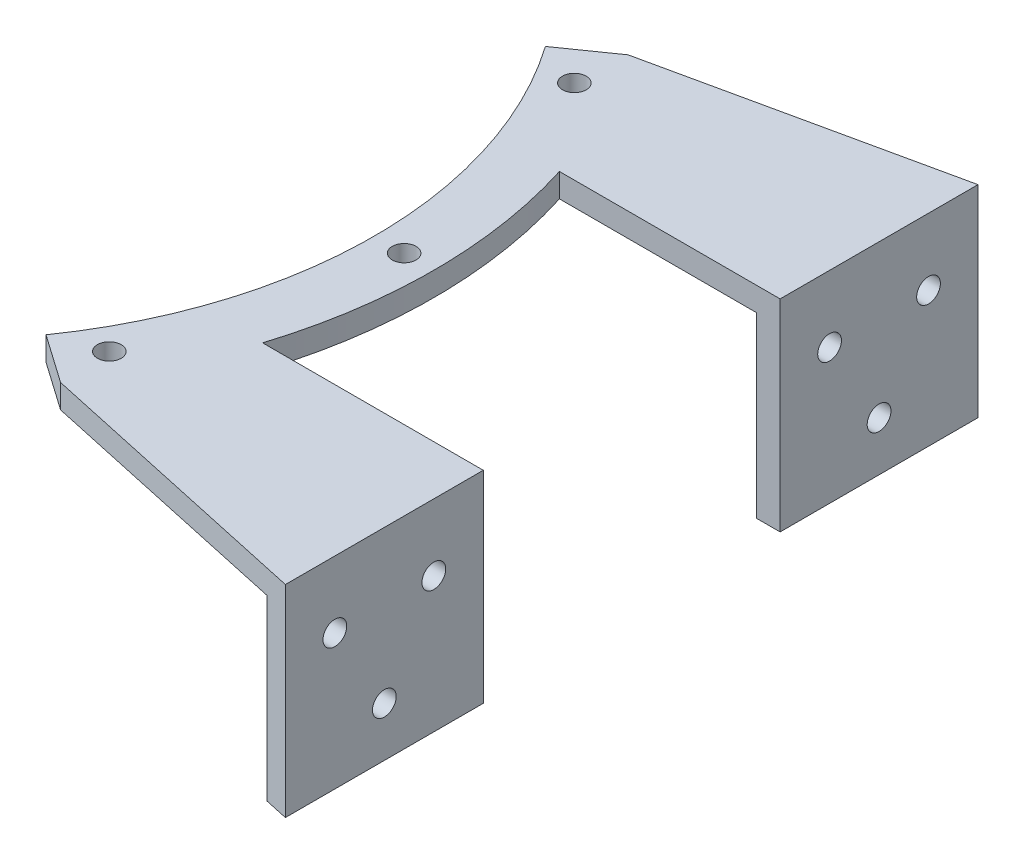
ISO-10303-21;
HEADER;
FILE_DESCRIPTION(('STEP AP214'),'2;1');
FILE_NAME('part.step','',(''),(''),'','','');
FILE_SCHEMA(('AUTOMOTIVE_DESIGN { 1 0 10303 214 1 1 1 1 }'));
ENDSEC;
DATA;
#1=APPLICATION_CONTEXT('core data for automotive mechanical design processes');
#2=APPLICATION_PROTOCOL_DEFINITION('international standard','automotive_design',2000,#1);
#3=PRODUCT_CONTEXT('',#1,'mechanical');
#4=PRODUCT('Part','Part','',(#3));
#5=PRODUCT_RELATED_PRODUCT_CATEGORY('part','',(#4));
#6=PRODUCT_DEFINITION_FORMATION('','',#4);
#7=PRODUCT_DEFINITION_CONTEXT('part definition',#1,'design');
#8=PRODUCT_DEFINITION('design','',#6,#7);
#9=PRODUCT_DEFINITION_SHAPE('','',#8);
#10=(LENGTH_UNIT() NAMED_UNIT(*) SI_UNIT(.MILLI.,.METRE.));
#11=(NAMED_UNIT(*) PLANE_ANGLE_UNIT() SI_UNIT($,.RADIAN.));
#12=(NAMED_UNIT(*) SI_UNIT($,.STERADIAN.) SOLID_ANGLE_UNIT());
#13=UNCERTAINTY_MEASURE_WITH_UNIT(LENGTH_MEASURE(1.E-05),#10,'distance_accuracy_value','');
#14=(GEOMETRIC_REPRESENTATION_CONTEXT(3) GLOBAL_UNCERTAINTY_ASSIGNED_CONTEXT((#13)) GLOBAL_UNIT_ASSIGNED_CONTEXT((#10,
#11,#12)) REPRESENTATION_CONTEXT('',''));
#15=CARTESIAN_POINT('',(0.,0.,0.));
#16=DIRECTION('',(0.,0.,1.));
#17=DIRECTION('',(1.,0.,0.));
#18=AXIS2_PLACEMENT_3D('',#15,#16,#17);
#19=CARTESIAN_POINT('',(0.,0.,0.));
#20=DIRECTION('',(0.,1.,0.));
#21=DIRECTION('',(0.,0.,1.));
#22=AXIS2_PLACEMENT_3D('',#19,#20,#21);
#23=PLANE('',#22);
#24=CARTESIAN_POINT('',(203.515969889343,0.,117.5));
#25=DIRECTION('',(0.,1.,0.));
#26=DIRECTION('',(0.,0.,1.));
#27=AXIS2_PLACEMENT_3D('',#24,#25,#26);
#28=CIRCLE('',#27,5.99999999999999);
#29=CARTESIAN_POINT('',(203.515969889343,0.,123.5));
#30=VERTEX_POINT('',#29);
#31=EDGE_CURVE('E191',#30,#30,#28,.T.);
#32=ORIENTED_EDGE('',*,*,#31,.T.);
#33=EDGE_LOOP('',(#32));
#34=FACE_BOUND('',#33,.T.);
#35=CARTESIAN_POINT('',(235.,0.,0.));
#36=DIRECTION('',(0.,1.,0.));
#37=DIRECTION('',(0.,0.,1.));
#38=AXIS2_PLACEMENT_3D('',#35,#36,#37);
#39=CIRCLE('',#38,5.99999999999999);
#40=CARTESIAN_POINT('',(235.,0.,5.99999999999999));
#41=VERTEX_POINT('',#40);
#42=EDGE_CURVE('E185',#41,#41,#39,.T.);
#43=ORIENTED_EDGE('',*,*,#42,.T.);
#44=EDGE_LOOP('',(#43));
#45=FACE_BOUND('',#44,.T.);
#46=CARTESIAN_POINT('',(203.515969889343,0.,-117.5));
#47=DIRECTION('',(0.,1.,0.));
#48=DIRECTION('',(0.,0.,1.));
#49=AXIS2_PLACEMENT_3D('',#46,#47,#48);
#50=CIRCLE('',#49,5.99999999999999);
#51=CARTESIAN_POINT('',(203.515969889343,0.,-111.5));
#52=VERTEX_POINT('',#51);
#53=EDGE_CURVE('E181',#52,#52,#50,.T.);
#54=ORIENTED_EDGE('',*,*,#53,.T.);
#55=EDGE_LOOP('',(#54));
#56=FACE_BOUND('',#55,.T.);
#57=DIRECTION('',(0.,0.,-1.));
#58=VECTOR('',#57,1.);
#59=CARTESIAN_POINT('',(338.,0.,-172.388158555313));
#60=LINE('',#59,#58);
#61=CARTESIAN_POINT('',(338.,0.,-75.));
#62=VERTEX_POINT('',#61);
#63=CARTESIAN_POINT('',(338.,0.,-172.388158555313));
#64=VERTEX_POINT('',#63);
#65=EDGE_CURVE('E153',#62,#64,#60,.T.);
#66=ORIENTED_EDGE('',*,*,#65,.F.);
#67=DIRECTION('',(1.,0.,0.));
#68=VECTOR('',#67,1.);
#69=CARTESIAN_POINT('',(350.,0.,-75.));
#70=LINE('',#69,#68);
#71=CARTESIAN_POINT('',(238.484800354236,0.,-75.));
#72=VERTEX_POINT('',#71);
#73=EDGE_CURVE('E158',#72,#62,#70,.T.);
#74=ORIENTED_EDGE('',*,*,#73,.F.);
#75=CARTESIAN_POINT('',(0.,0.,0.));
#76=DIRECTION('',(0.,1.,0.));
#77=DIRECTION('',(0.,0.,1.));
#78=AXIS2_PLACEMENT_3D('',#75,#76,#77);
#79=CIRCLE('',#78,250.);
#80=CARTESIAN_POINT('',(238.484800354236,0.,75.));
#81=VERTEX_POINT('',#80);
#82=EDGE_CURVE('E203',#81,#72,#79,.T.);
#83=ORIENTED_EDGE('',*,*,#82,.F.);
#84=DIRECTION('',(-1.,0.,0.));
#85=VECTOR('',#84,1.);
#86=CARTESIAN_POINT('',(350.,0.,75.));
#87=LINE('',#86,#85);
#88=CARTESIAN_POINT('',(338.,0.,75.));
#89=VERTEX_POINT('',#88);
#90=EDGE_CURVE('E233',#89,#81,#87,.T.);
#91=ORIENTED_EDGE('',*,*,#90,.F.);
#92=DIRECTION('',(0.,0.,-1.));
#93=VECTOR('',#92,1.);
#94=CARTESIAN_POINT('',(338.,0.,75.));
#95=LINE('',#94,#93);
#96=CARTESIAN_POINT('',(338.,0.,172.388158555313));
#97=VERTEX_POINT('',#96);
#98=EDGE_CURVE('E58',#97,#89,#95,.T.);
#99=ORIENTED_EDGE('',*,*,#98,.F.);
#100=DIRECTION('',(0.97712316091758,0.,0.212674230687305));
#101=VECTOR('',#100,1.);
#102=CARTESIAN_POINT('',(204.788011072248,0.,143.394109087761));
#103=LINE('',#102,#101);
#104=CARTESIAN_POINT('',(204.788011072248,0.,143.394109087761));
#105=VERTEX_POINT('',#104);
#106=EDGE_CURVE('E231',#105,#97,#103,.T.);
#107=ORIENTED_EDGE('',*,*,#106,.F.);
#108=DIRECTION('',(0.819152044288993,0.,0.573576436351044));
#109=VECTOR('',#108,1.);
#110=CARTESIAN_POINT('',(180.213449743579,0.,126.18681599723));
#111=LINE('',#110,#109);
#112=CARTESIAN_POINT('',(180.213449743578,0.,126.18681599723));
#113=VERTEX_POINT('',#112);
#114=EDGE_CURVE('E229',#113,#105,#111,.T.);
#115=ORIENTED_EDGE('',*,*,#114,.F.);
#116=CARTESIAN_POINT('',(0.,0.,0.));
#117=DIRECTION('',(0.,-1.,0.));
#118=DIRECTION('',(0.,0.,1.));
#119=AXIS2_PLACEMENT_3D('',#116,#117,#118);
#120=CIRCLE('',#119,220.);
#121=CARTESIAN_POINT('',(180.213449743579,0.,-126.18681599723));
#122=VERTEX_POINT('',#121);
#123=EDGE_CURVE('E227',#122,#113,#120,.T.);
#124=ORIENTED_EDGE('',*,*,#123,.F.);
#125=DIRECTION('',(-0.819152044288993,0.,0.573576436351044));
#126=VECTOR('',#125,1.);
#127=CARTESIAN_POINT('',(180.213449743579,0.,-126.18681599723));
#128=LINE('',#127,#126);
#129=CARTESIAN_POINT('',(204.788011072248,0.,-143.394109087761));
#130=VERTEX_POINT('',#129);
#131=EDGE_CURVE('E225',#130,#122,#128,.T.);
#132=ORIENTED_EDGE('',*,*,#131,.F.);
#133=DIRECTION('',(-0.97712316091758,0.,0.212674230687305));
#134=VECTOR('',#133,1.);
#135=CARTESIAN_POINT('',(204.788011072248,0.,-143.394109087761));
#136=LINE('',#135,#134);
#137=EDGE_CURVE('E223',#64,#130,#136,.T.);
#138=ORIENTED_EDGE('',*,*,#137,.F.);
#139=EDGE_LOOP('',(#66,#74,#83,#91,#99,#107,#115,#124,#132,#138));
#140=FACE_BOUND('',#139,.T.);
#141=ADVANCED_FACE('F35',(#34,#45,#56,#140),#23,.F.);
#142=CARTESIAN_POINT('',(0.,12.,0.));
#143=DIRECTION('',(0.,1.,0.));
#144=DIRECTION('',(0.,0.,1.));
#145=AXIS2_PLACEMENT_3D('',#142,#143,#144);
#146=PLANE('',#145);
#147=CARTESIAN_POINT('',(235.,12.,0.));
#148=DIRECTION('',(0.,1.,0.));
#149=DIRECTION('',(0.,0.,1.));
#150=AXIS2_PLACEMENT_3D('',#147,#148,#149);
#151=CIRCLE('',#150,5.99999999999999);
#152=CARTESIAN_POINT('',(235.,12.,5.99999999999999));
#153=VERTEX_POINT('',#152);
#154=EDGE_CURVE('E188',#153,#153,#151,.T.);
#155=ORIENTED_EDGE('',*,*,#154,.F.);
#156=EDGE_LOOP('',(#155));
#157=FACE_BOUND('',#156,.T.);
#158=DIRECTION('',(1.,0.,0.));
#159=VECTOR('',#158,1.);
#160=CARTESIAN_POINT('',(350.,12.,-75.));
#161=LINE('',#160,#159);
#162=CARTESIAN_POINT('',(238.484800354236,12.,-75.));
#163=VERTEX_POINT('',#162);
#164=CARTESIAN_POINT('',(350.,12.,-75.));
#165=VERTEX_POINT('',#164);
#166=EDGE_CURVE('E199',#163,#165,#161,.T.);
#167=ORIENTED_EDGE('',*,*,#166,.T.);
#168=DIRECTION('',(0.,0.,-1.));
#169=VECTOR('',#168,1.);
#170=CARTESIAN_POINT('',(350.,12.,-175.));
#171=LINE('',#170,#169);
#172=CARTESIAN_POINT('',(350.,12.,-175.));
#173=VERTEX_POINT('',#172);
#174=EDGE_CURVE('E202',#165,#173,#171,.T.);
#175=ORIENTED_EDGE('',*,*,#174,.T.);
#176=DIRECTION('',(-0.97712316091758,0.,0.212674230687305));
#177=VECTOR('',#176,1.);
#178=CARTESIAN_POINT('',(204.788011072248,12.,-143.394109087761));
#179=LINE('',#178,#177);
#180=CARTESIAN_POINT('',(204.788011072248,12.,-143.394109087761));
#181=VERTEX_POINT('',#180);
#182=EDGE_CURVE('E205',#173,#181,#179,.T.);
#183=ORIENTED_EDGE('',*,*,#182,.T.);
#184=DIRECTION('',(-0.819152044288993,0.,0.573576436351044));
#185=VECTOR('',#184,1.);
#186=CARTESIAN_POINT('',(180.213449743579,12.,-126.18681599723));
#187=LINE('',#186,#185);
#188=CARTESIAN_POINT('',(180.213449743579,12.,-126.18681599723));
#189=VERTEX_POINT('',#188);
#190=EDGE_CURVE('E207',#181,#189,#187,.T.);
#191=ORIENTED_EDGE('',*,*,#190,.T.);
#192=CARTESIAN_POINT('',(0.,12.,0.));
#193=DIRECTION('',(0.,-1.,0.));
#194=DIRECTION('',(0.,0.,1.));
#195=AXIS2_PLACEMENT_3D('',#192,#193,#194);
#196=CIRCLE('',#195,220.);
#197=CARTESIAN_POINT('',(180.213449743578,12.,126.18681599723));
#198=VERTEX_POINT('',#197);
#199=EDGE_CURVE('E209',#189,#198,#196,.T.);
#200=ORIENTED_EDGE('',*,*,#199,.T.);
#201=DIRECTION('',(0.819152044288993,0.,0.573576436351044));
#202=VECTOR('',#201,1.);
#203=CARTESIAN_POINT('',(180.213449743579,12.,126.18681599723));
#204=LINE('',#203,#202);
#205=CARTESIAN_POINT('',(204.788011072248,12.,143.394109087761));
#206=VERTEX_POINT('',#205);
#207=EDGE_CURVE('E211',#198,#206,#204,.T.);
#208=ORIENTED_EDGE('',*,*,#207,.T.);
#209=DIRECTION('',(0.97712316091758,0.,0.212674230687305));
#210=VECTOR('',#209,1.);
#211=CARTESIAN_POINT('',(204.788011072248,12.,143.394109087761));
#212=LINE('',#211,#210);
#213=CARTESIAN_POINT('',(350.,12.,175.));
#214=VERTEX_POINT('',#213);
#215=EDGE_CURVE('E213',#206,#214,#212,.T.);
#216=ORIENTED_EDGE('',*,*,#215,.T.);
#217=DIRECTION('',(0.,0.,-1.));
#218=VECTOR('',#217,1.);
#219=CARTESIAN_POINT('',(350.,12.,175.));
#220=LINE('',#219,#218);
#221=CARTESIAN_POINT('',(350.,12.,75.));
#222=VERTEX_POINT('',#221);
#223=EDGE_CURVE('E215',#214,#222,#220,.T.);
#224=ORIENTED_EDGE('',*,*,#223,.T.);
#225=DIRECTION('',(-1.,0.,0.));
#226=VECTOR('',#225,1.);
#227=CARTESIAN_POINT('',(350.,12.,75.));
#228=LINE('',#227,#226);
#229=CARTESIAN_POINT('',(238.484800354236,12.,75.));
#230=VERTEX_POINT('',#229);
#231=EDGE_CURVE('E217',#222,#230,#228,.T.);
#232=ORIENTED_EDGE('',*,*,#231,.T.);
#233=CARTESIAN_POINT('',(0.,12.,0.));
#234=DIRECTION('',(0.,1.,0.));
#235=DIRECTION('',(0.,0.,1.));
#236=AXIS2_PLACEMENT_3D('',#233,#234,#235);
#237=CIRCLE('',#236,250.);
#238=EDGE_CURVE('E219',#230,#163,#237,.T.);
#239=ORIENTED_EDGE('',*,*,#238,.T.);
#240=EDGE_LOOP('',(#167,#175,#183,#191,#200,#208,#216,#224,#232,#239));
#241=FACE_BOUND('',#240,.T.);
#242=CARTESIAN_POINT('',(203.515969889343,12.,117.5));
#243=DIRECTION('',(0.,1.,0.));
#244=DIRECTION('',(0.,0.,1.));
#245=AXIS2_PLACEMENT_3D('',#242,#243,#244);
#246=CIRCLE('',#245,5.99999999999999);
#247=CARTESIAN_POINT('',(203.515969889343,12.,123.5));
#248=VERTEX_POINT('',#247);
#249=EDGE_CURVE('E194',#248,#248,#246,.T.);
#250=ORIENTED_EDGE('',*,*,#249,.F.);
#251=EDGE_LOOP('',(#250));
#252=FACE_BOUND('',#251,.T.);
#253=CARTESIAN_POINT('',(203.515969889343,12.,-117.5));
#254=DIRECTION('',(0.,1.,0.));
#255=DIRECTION('',(0.,0.,1.));
#256=AXIS2_PLACEMENT_3D('',#253,#254,#255);
#257=CIRCLE('',#256,5.99999999999999);
#258=CARTESIAN_POINT('',(203.515969889343,12.,-111.5));
#259=VERTEX_POINT('',#258);
#260=EDGE_CURVE('E182',#259,#259,#257,.T.);
#261=ORIENTED_EDGE('',*,*,#260,.F.);
#262=EDGE_LOOP('',(#261));
#263=FACE_BOUND('',#262,.T.);
#264=ADVANCED_FACE('F329',(#157,#241,#252,#263),#146,.T.);
#265=CARTESIAN_POINT('',(350.,12.,-75.));
#266=DIRECTION('',(0.,0.,-1.));
#267=DIRECTION('',(-1.,0.,0.));
#268=AXIS2_PLACEMENT_3D('',#265,#266,#267);
#269=PLANE('',#268);
#270=ORIENTED_EDGE('',*,*,#73,.T.);
#271=DIRECTION('',(0.,1.,0.));
#272=VECTOR('',#271,1.);
#273=CARTESIAN_POINT('',(338.,-90.,-75.));
#274=LINE('',#273,#272);
#275=CARTESIAN_POINT('',(338.,-90.,-75.));
#276=VERTEX_POINT('',#275);
#277=EDGE_CURVE('E139',#276,#62,#274,.T.);
#278=ORIENTED_EDGE('',*,*,#277,.F.);
#279=DIRECTION('',(-1.,0.,0.));
#280=VECTOR('',#279,1.);
#281=CARTESIAN_POINT('',(338.,-90.,-75.));
#282=LINE('',#281,#280);
#283=CARTESIAN_POINT('',(350.,-90.,-75.));
#284=VERTEX_POINT('',#283);
#285=EDGE_CURVE('E144',#284,#276,#282,.T.);
#286=ORIENTED_EDGE('',*,*,#285,.F.);
#287=DIRECTION('',(0.,-1.,0.));
#288=VECTOR('',#287,1.);
#289=CARTESIAN_POINT('',(350.,12.,-75.));
#290=LINE('',#289,#288);
#291=EDGE_CURVE('E11',#165,#284,#290,.T.);
#292=ORIENTED_EDGE('',*,*,#291,.F.);
#293=ORIENTED_EDGE('',*,*,#166,.F.);
#294=DIRECTION('',(0.,-1.,0.));
#295=VECTOR('',#294,1.);
#296=CARTESIAN_POINT('',(238.484800354236,12.,-75.));
#297=LINE('',#296,#295);
#298=EDGE_CURVE('E221',#163,#72,#297,.T.);
#299=ORIENTED_EDGE('',*,*,#298,.T.);
#300=EDGE_LOOP('',(#270,#278,#286,#292,#293,#299));
#301=FACE_BOUND('',#300,.T.);
#302=ADVANCED_FACE('F37',(#301),#269,.F.);
#303=CARTESIAN_POINT('',(350.,12.,-175.));
#304=DIRECTION('',(-1.,0.,0.));
#305=DIRECTION('',(0.,0.,1.));
#306=AXIS2_PLACEMENT_3D('',#303,#304,#305);
#307=PLANE('',#306);
#308=CARTESIAN_POINT('',(350.,-21.6987298107781,-150.));
#309=DIRECTION('',(-1.,0.,0.));
#310=DIRECTION('',(0.,0.,1.));
#311=AXIS2_PLACEMENT_3D('',#308,#309,#310);
#312=CIRCLE('',#311,6.00000000000002);
#313=CARTESIAN_POINT('',(350.,-21.6987298107781,-144.));
#314=VERTEX_POINT('',#313);
#315=EDGE_CURVE('E263',#314,#314,#312,.T.);
#316=ORIENTED_EDGE('',*,*,#315,.T.);
#317=EDGE_LOOP('',(#316));
#318=FACE_BOUND('',#317,.T.);
#319=CARTESIAN_POINT('',(350.,-21.6987298107781,-100.));
#320=DIRECTION('',(-1.,0.,0.));
#321=DIRECTION('',(0.,0.,1.));
#322=AXIS2_PLACEMENT_3D('',#319,#320,#321);
#323=CIRCLE('',#322,6.);
#324=CARTESIAN_POINT('',(350.,-21.6987298107781,-94.));
#325=VERTEX_POINT('',#324);
#326=EDGE_CURVE('E298',#325,#325,#323,.T.);
#327=ORIENTED_EDGE('',*,*,#326,.T.);
#328=EDGE_LOOP('',(#327));
#329=FACE_BOUND('',#328,.T.);
#330=CARTESIAN_POINT('',(350.,-65.,-125.));
#331=DIRECTION('',(-1.,0.,0.));
#332=DIRECTION('',(0.,0.,1.));
#333=AXIS2_PLACEMENT_3D('',#330,#331,#332);
#334=CIRCLE('',#333,6.);
#335=CARTESIAN_POINT('',(350.,-65.,-119.));
#336=VERTEX_POINT('',#335);
#337=EDGE_CURVE('E271',#336,#336,#334,.T.);
#338=ORIENTED_EDGE('',*,*,#337,.T.);
#339=EDGE_LOOP('',(#338));
#340=FACE_BOUND('',#339,.T.);
#341=ORIENTED_EDGE('',*,*,#291,.T.);
#342=DIRECTION('',(0.,0.,1.));
#343=VECTOR('',#342,1.);
#344=CARTESIAN_POINT('',(350.,-90.,-75.));
#345=LINE('',#344,#343);
#346=CARTESIAN_POINT('',(350.,-90.,-175.));
#347=VERTEX_POINT('',#346);
#348=EDGE_CURVE('E150',#347,#284,#345,.T.);
#349=ORIENTED_EDGE('',*,*,#348,.F.);
#350=DIRECTION('',(0.,-1.,0.));
#351=VECTOR('',#350,1.);
#352=CARTESIAN_POINT('',(350.,12.,-175.));
#353=LINE('',#352,#351);
#354=EDGE_CURVE('E43',#173,#347,#353,.T.);
#355=ORIENTED_EDGE('',*,*,#354,.F.);
#356=ORIENTED_EDGE('',*,*,#174,.F.);
#357=EDGE_LOOP('',(#341,#349,#355,#356));
#358=FACE_BOUND('',#357,.T.);
#359=ADVANCED_FACE('F261',(#318,#329,#340,#358),#307,.F.);
#360=CARTESIAN_POINT('',(204.788011072248,12.,-143.394109087761));
#361=DIRECTION('',(0.212674230687305,0.,0.97712316091758));
#362=DIRECTION('',(0.97712316091758,0.,-0.212674230687305));
#363=AXIS2_PLACEMENT_3D('',#360,#361,#362);
#364=PLANE('',#363);
#365=ORIENTED_EDGE('',*,*,#354,.T.);
#366=DIRECTION('',(0.977123160917581,0.,-0.212674230687303));
#367=VECTOR('',#366,1.);
#368=CARTESIAN_POINT('',(350.,-90.,-175.));
#369=LINE('',#368,#367);
#370=CARTESIAN_POINT('',(338.,-90.,-172.388158555313));
#371=VERTEX_POINT('',#370);
#372=EDGE_CURVE('E143',#371,#347,#369,.T.);
#373=ORIENTED_EDGE('',*,*,#372,.F.);
#374=DIRECTION('',(0.,1.,0.));
#375=VECTOR('',#374,1.);
#376=CARTESIAN_POINT('',(338.,-90.,-172.388158555313));
#377=LINE('',#376,#375);
#378=EDGE_CURVE('E50',#371,#64,#377,.T.);
#379=ORIENTED_EDGE('',*,*,#378,.T.);
#380=ORIENTED_EDGE('',*,*,#137,.T.);
#381=DIRECTION('',(0.,-1.,0.));
#382=VECTOR('',#381,1.);
#383=CARTESIAN_POINT('',(204.788011072248,12.,-143.394109087761));
#384=LINE('',#383,#382);
#385=EDGE_CURVE('E253',#181,#130,#384,.T.);
#386=ORIENTED_EDGE('',*,*,#385,.F.);
#387=ORIENTED_EDGE('',*,*,#182,.F.);
#388=EDGE_LOOP('',(#365,#373,#379,#380,#386,#387));
#389=FACE_BOUND('',#388,.T.);
#390=ADVANCED_FACE('F257',(#389),#364,.F.);
#391=CARTESIAN_POINT('',(180.213449743579,12.,-126.18681599723));
#392=DIRECTION('',(0.573576436351044,0.,0.819152044288993));
#393=DIRECTION('',(0.819152044288993,0.,-0.573576436351044));
#394=AXIS2_PLACEMENT_3D('',#391,#392,#393);
#395=PLANE('',#394);
#396=ORIENTED_EDGE('',*,*,#131,.T.);
#397=DIRECTION('',(0.,-1.,0.));
#398=VECTOR('',#397,1.);
#399=CARTESIAN_POINT('',(180.213449743579,12.,-126.18681599723));
#400=LINE('',#399,#398);
#401=EDGE_CURVE('E250',#189,#122,#400,.T.);
#402=ORIENTED_EDGE('',*,*,#401,.F.);
#403=ORIENTED_EDGE('',*,*,#190,.F.);
#404=ORIENTED_EDGE('',*,*,#385,.T.);
#405=EDGE_LOOP('',(#396,#402,#403,#404));
#406=FACE_BOUND('',#405,.T.);
#407=ADVANCED_FACE('F364',(#406),#395,.F.);
#408=CARTESIAN_POINT('',(0.,12.,0.));
#409=DIRECTION('',(0.,-1.,0.));
#410=DIRECTION('',(0.,0.,-1.));
#411=AXIS2_PLACEMENT_3D('',#408,#409,#410);
#412=CYLINDRICAL_SURFACE('',#411,220.);
#413=ORIENTED_EDGE('',*,*,#123,.T.);
#414=DIRECTION('',(0.,-1.,0.));
#415=VECTOR('',#414,1.);
#416=CARTESIAN_POINT('',(180.213449743578,12.,126.18681599723));
#417=LINE('',#416,#415);
#418=EDGE_CURVE('E247',#198,#113,#417,.T.);
#419=ORIENTED_EDGE('',*,*,#418,.F.);
#420=ORIENTED_EDGE('',*,*,#199,.F.);
#421=ORIENTED_EDGE('',*,*,#401,.T.);
#422=EDGE_LOOP('',(#413,#419,#420,#421));
#423=FACE_BOUND('',#422,.T.);
#424=ADVANCED_FACE('F360',(#423),#412,.F.);
#425=CARTESIAN_POINT('',(180.213449743579,12.,126.18681599723));
#426=DIRECTION('',(0.573576436351044,0.,-0.819152044288993));
#427=DIRECTION('',(-0.819152044288993,0.,-0.573576436351044));
#428=AXIS2_PLACEMENT_3D('',#425,#426,#427);
#429=PLANE('',#428);
#430=ORIENTED_EDGE('',*,*,#114,.T.);
#431=DIRECTION('',(0.,-1.,0.));
#432=VECTOR('',#431,1.);
#433=CARTESIAN_POINT('',(204.788011072248,12.,143.394109087761));
#434=LINE('',#433,#432);
#435=EDGE_CURVE('E244',#206,#105,#434,.T.);
#436=ORIENTED_EDGE('',*,*,#435,.F.);
#437=ORIENTED_EDGE('',*,*,#207,.F.);
#438=ORIENTED_EDGE('',*,*,#418,.T.);
#439=EDGE_LOOP('',(#430,#436,#437,#438));
#440=FACE_BOUND('',#439,.T.);
#441=ADVANCED_FACE('F356',(#440),#429,.F.);
#442=CARTESIAN_POINT('',(204.788011072248,12.,143.394109087761));
#443=DIRECTION('',(0.212674230687305,0.,-0.97712316091758));
#444=DIRECTION('',(-0.97712316091758,0.,-0.212674230687305));
#445=AXIS2_PLACEMENT_3D('',#442,#443,#444);
#446=PLANE('',#445);
#447=ORIENTED_EDGE('',*,*,#106,.T.);
#448=DIRECTION('',(0.,1.,0.));
#449=VECTOR('',#448,1.);
#450=CARTESIAN_POINT('',(338.,-90.,172.388158555313));
#451=LINE('',#450,#449);
#452=CARTESIAN_POINT('',(338.,-90.,172.388158555313));
#453=VERTEX_POINT('',#452);
#454=EDGE_CURVE('E178',#453,#97,#451,.T.);
#455=ORIENTED_EDGE('',*,*,#454,.F.);
#456=DIRECTION('',(-0.97712316091758,0.,-0.212674230687306));
#457=VECTOR('',#456,1.);
#458=CARTESIAN_POINT('',(338.,-90.,172.388158555313));
#459=LINE('',#458,#457);
#460=CARTESIAN_POINT('',(350.,-90.,175.));
#461=VERTEX_POINT('',#460);
#462=EDGE_CURVE('E160',#461,#453,#459,.T.);
#463=ORIENTED_EDGE('',*,*,#462,.F.);
#464=DIRECTION('',(0.,-1.,0.));
#465=VECTOR('',#464,1.);
#466=CARTESIAN_POINT('',(350.,12.,175.));
#467=LINE('',#466,#465);
#468=EDGE_CURVE('E242',#214,#461,#467,.T.);
#469=ORIENTED_EDGE('',*,*,#468,.F.);
#470=ORIENTED_EDGE('',*,*,#215,.F.);
#471=ORIENTED_EDGE('',*,*,#435,.T.);
#472=EDGE_LOOP('',(#447,#455,#463,#469,#470,#471));
#473=FACE_BOUND('',#472,.T.);
#474=ADVANCED_FACE('F352',(#473),#446,.F.);
#475=CARTESIAN_POINT('',(350.,12.,175.));
#476=DIRECTION('',(-1.,0.,0.));
#477=DIRECTION('',(0.,0.,1.));
#478=AXIS2_PLACEMENT_3D('',#475,#476,#477);
#479=PLANE('',#478);
#480=CARTESIAN_POINT('',(350.,-21.698729810778,100.));
#481=DIRECTION('',(-1.,0.,0.));
#482=DIRECTION('',(0.,0.,-1.));
#483=AXIS2_PLACEMENT_3D('',#480,#481,#482);
#484=CIRCLE('',#483,6.);
#485=CARTESIAN_POINT('',(350.,-21.698729810778,94.));
#486=VERTEX_POINT('',#485);
#487=EDGE_CURVE('E274',#486,#486,#484,.T.);
#488=ORIENTED_EDGE('',*,*,#487,.T.);
#489=EDGE_LOOP('',(#488));
#490=FACE_BOUND('',#489,.T.);
#491=CARTESIAN_POINT('',(350.,-21.698729810778,150.));
#492=DIRECTION('',(-1.,0.,0.));
#493=DIRECTION('',(0.,0.,-1.));
#494=AXIS2_PLACEMENT_3D('',#491,#492,#493);
#495=CIRCLE('',#494,6.00000000000002);
#496=CARTESIAN_POINT('',(350.,-21.698729810778,144.));
#497=VERTEX_POINT('',#496);
#498=EDGE_CURVE('E292',#497,#497,#495,.T.);
#499=ORIENTED_EDGE('',*,*,#498,.T.);
#500=EDGE_LOOP('',(#499));
#501=FACE_BOUND('',#500,.T.);
#502=CARTESIAN_POINT('',(350.,-65.,125.));
#503=DIRECTION('',(-1.,0.,0.));
#504=DIRECTION('',(0.,0.,-1.));
#505=AXIS2_PLACEMENT_3D('',#502,#503,#504);
#506=CIRCLE('',#505,5.99999999999999);
#507=CARTESIAN_POINT('',(350.,-65.,119.));
#508=VERTEX_POINT('',#507);
#509=EDGE_CURVE('E286',#508,#508,#506,.T.);
#510=ORIENTED_EDGE('',*,*,#509,.T.);
#511=EDGE_LOOP('',(#510));
#512=FACE_BOUND('',#511,.T.);
#513=ORIENTED_EDGE('',*,*,#468,.T.);
#514=DIRECTION('',(0.,0.,1.));
#515=VECTOR('',#514,1.);
#516=CARTESIAN_POINT('',(350.,-90.,175.));
#517=LINE('',#516,#515);
#518=CARTESIAN_POINT('',(350.,-90.,75.));
#519=VERTEX_POINT('',#518);
#520=EDGE_CURVE('E172',#519,#461,#517,.T.);
#521=ORIENTED_EDGE('',*,*,#520,.F.);
#522=DIRECTION('',(0.,-1.,0.));
#523=VECTOR('',#522,1.);
#524=CARTESIAN_POINT('',(350.,12.,75.));
#525=LINE('',#524,#523);
#526=EDGE_CURVE('E240',#222,#519,#525,.T.);
#527=ORIENTED_EDGE('',*,*,#526,.F.);
#528=ORIENTED_EDGE('',*,*,#223,.F.);
#529=EDGE_LOOP('',(#513,#521,#527,#528));
#530=FACE_BOUND('',#529,.T.);
#531=ADVANCED_FACE('F348',(#490,#501,#512,#530),#479,.F.);
#532=CARTESIAN_POINT('',(350.,12.,75.));
#533=DIRECTION('',(0.,0.,1.));
#534=DIRECTION('',(1.,0.,0.));
#535=AXIS2_PLACEMENT_3D('',#532,#533,#534);
#536=PLANE('',#535);
#537=ORIENTED_EDGE('',*,*,#526,.T.);
#538=DIRECTION('',(1.,0.,0.));
#539=VECTOR('',#538,1.);
#540=CARTESIAN_POINT('',(350.,-90.,75.));
#541=LINE('',#540,#539);
#542=CARTESIAN_POINT('',(338.,-90.,75.));
#543=VERTEX_POINT('',#542);
#544=EDGE_CURVE('E169',#543,#519,#541,.T.);
#545=ORIENTED_EDGE('',*,*,#544,.F.);
#546=DIRECTION('',(0.,1.,0.));
#547=VECTOR('',#546,1.);
#548=CARTESIAN_POINT('',(338.,-90.,75.));
#549=LINE('',#548,#547);
#550=EDGE_CURVE('E174',#543,#89,#549,.T.);
#551=ORIENTED_EDGE('',*,*,#550,.T.);
#552=ORIENTED_EDGE('',*,*,#90,.T.);
#553=DIRECTION('',(0.,-1.,0.));
#554=VECTOR('',#553,1.);
#555=CARTESIAN_POINT('',(238.484800354236,12.,75.));
#556=LINE('',#555,#554);
#557=EDGE_CURVE('E237',#230,#81,#556,.T.);
#558=ORIENTED_EDGE('',*,*,#557,.F.);
#559=ORIENTED_EDGE('',*,*,#231,.F.);
#560=EDGE_LOOP('',(#537,#545,#551,#552,#558,#559));
#561=FACE_BOUND('',#560,.T.);
#562=ADVANCED_FACE('F344',(#561),#536,.F.);
#563=CARTESIAN_POINT('',(0.,12.,0.));
#564=DIRECTION('',(0.,-1.,0.));
#565=DIRECTION('',(0.,0.,-1.));
#566=AXIS2_PLACEMENT_3D('',#563,#564,#565);
#567=CYLINDRICAL_SURFACE('',#566,250.);
#568=ORIENTED_EDGE('',*,*,#82,.T.);
#569=ORIENTED_EDGE('',*,*,#298,.F.);
#570=ORIENTED_EDGE('',*,*,#238,.F.);
#571=ORIENTED_EDGE('',*,*,#557,.T.);
#572=EDGE_LOOP('',(#568,#569,#570,#571));
#573=FACE_BOUND('',#572,.T.);
#574=ADVANCED_FACE('F340',(#573),#567,.T.);
#575=CARTESIAN_POINT('',(203.515969889343,12.,117.5));
#576=DIRECTION('',(0.,-1.,0.));
#577=DIRECTION('',(0.,0.,-1.));
#578=AXIS2_PLACEMENT_3D('',#575,#576,#577);
#579=CYLINDRICAL_SURFACE('',#578,5.99999999999999);
#580=ORIENTED_EDGE('',*,*,#249,.T.);
#581=EDGE_LOOP('',(#580));
#582=FACE_BOUND('',#581,.T.);
#583=ORIENTED_EDGE('',*,*,#31,.F.);
#584=EDGE_LOOP('',(#583));
#585=FACE_BOUND('',#584,.T.);
#586=ADVANCED_FACE('F343',(#582,#585),#579,.F.);
#587=CARTESIAN_POINT('',(235.,12.,0.));
#588=DIRECTION('',(0.,-1.,0.));
#589=DIRECTION('',(0.,0.,-1.));
#590=AXIS2_PLACEMENT_3D('',#587,#588,#589);
#591=CYLINDRICAL_SURFACE('',#590,5.99999999999999);
#592=ORIENTED_EDGE('',*,*,#154,.T.);
#593=EDGE_LOOP('',(#592));
#594=FACE_BOUND('',#593,.T.);
#595=ORIENTED_EDGE('',*,*,#42,.F.);
#596=EDGE_LOOP('',(#595));
#597=FACE_BOUND('',#596,.T.);
#598=ADVANCED_FACE('F422',(#594,#597),#591,.F.);
#599=CARTESIAN_POINT('',(203.515969889343,12.,-117.5));
#600=DIRECTION('',(0.,-1.,0.));
#601=DIRECTION('',(0.,0.,-1.));
#602=AXIS2_PLACEMENT_3D('',#599,#600,#601);
#603=CYLINDRICAL_SURFACE('',#602,5.99999999999999);
#604=ORIENTED_EDGE('',*,*,#260,.T.);
#605=EDGE_LOOP('',(#604));
#606=FACE_BOUND('',#605,.T.);
#607=ORIENTED_EDGE('',*,*,#53,.F.);
#608=EDGE_LOOP('',(#607));
#609=FACE_BOUND('',#608,.T.);
#610=ADVANCED_FACE('F431',(#606,#609),#603,.F.);
#611=CARTESIAN_POINT('',(338.,-90.,75.));
#612=DIRECTION('',(1.,0.,0.));
#613=DIRECTION('',(0.,0.,-1.));
#614=AXIS2_PLACEMENT_3D('',#611,#612,#613);
#615=PLANE('',#614);
#616=CARTESIAN_POINT('',(338.,-21.698729810778,100.));
#617=DIRECTION('',(-1.,0.,0.));
#618=DIRECTION('',(0.,0.,-1.));
#619=AXIS2_PLACEMENT_3D('',#616,#617,#618);
#620=CIRCLE('',#619,6.);
#621=CARTESIAN_POINT('',(338.,-21.698729810778,94.));
#622=VERTEX_POINT('',#621);
#623=EDGE_CURVE('E278',#622,#622,#620,.T.);
#624=ORIENTED_EDGE('',*,*,#623,.F.);
#625=EDGE_LOOP('',(#624));
#626=FACE_BOUND('',#625,.T.);
#627=CARTESIAN_POINT('',(338.,-21.698729810778,150.));
#628=DIRECTION('',(-1.,0.,0.));
#629=DIRECTION('',(0.,0.,-1.));
#630=AXIS2_PLACEMENT_3D('',#627,#628,#629);
#631=CIRCLE('',#630,6.00000000000002);
#632=CARTESIAN_POINT('',(338.,-21.698729810778,144.));
#633=VERTEX_POINT('',#632);
#634=EDGE_CURVE('E295',#633,#633,#631,.T.);
#635=ORIENTED_EDGE('',*,*,#634,.F.);
#636=EDGE_LOOP('',(#635));
#637=FACE_BOUND('',#636,.T.);
#638=CARTESIAN_POINT('',(338.,-65.,125.));
#639=DIRECTION('',(-1.,0.,0.));
#640=DIRECTION('',(0.,0.,-1.));
#641=AXIS2_PLACEMENT_3D('',#638,#639,#640);
#642=CIRCLE('',#641,5.99999999999999);
#643=CARTESIAN_POINT('',(338.,-65.,119.));
#644=VERTEX_POINT('',#643);
#645=EDGE_CURVE('E289',#644,#644,#642,.T.);
#646=ORIENTED_EDGE('',*,*,#645,.F.);
#647=EDGE_LOOP('',(#646));
#648=FACE_BOUND('',#647,.T.);
#649=ORIENTED_EDGE('',*,*,#98,.T.);
#650=ORIENTED_EDGE('',*,*,#550,.F.);
#651=DIRECTION('',(0.,0.,-1.));
#652=VECTOR('',#651,1.);
#653=CARTESIAN_POINT('',(338.,-90.,75.));
#654=LINE('',#653,#652);
#655=EDGE_CURVE('E167',#453,#543,#654,.T.);
#656=ORIENTED_EDGE('',*,*,#655,.F.);
#657=ORIENTED_EDGE('',*,*,#454,.T.);
#658=EDGE_LOOP('',(#649,#650,#656,#657));
#659=FACE_BOUND('',#658,.T.);
#660=ADVANCED_FACE('F440',(#626,#637,#648,#659),#615,.F.);
#661=CARTESIAN_POINT('',(0.,-90.,0.));
#662=DIRECTION('',(0.,1.,0.));
#663=DIRECTION('',(0.,0.,1.));
#664=AXIS2_PLACEMENT_3D('',#661,#662,#663);
#665=PLANE('',#664);
#666=ORIENTED_EDGE('',*,*,#462,.T.);
#667=ORIENTED_EDGE('',*,*,#655,.T.);
#668=ORIENTED_EDGE('',*,*,#544,.T.);
#669=ORIENTED_EDGE('',*,*,#520,.T.);
#670=EDGE_LOOP('',(#666,#667,#668,#669));
#671=FACE_BOUND('',#670,.T.);
#672=ADVANCED_FACE('F308',(#671),#665,.F.);
#673=CARTESIAN_POINT('',(338.,-90.,-172.388158555313));
#674=DIRECTION('',(1.,0.,0.));
#675=DIRECTION('',(0.,0.,-1.));
#676=AXIS2_PLACEMENT_3D('',#673,#674,#675);
#677=PLANE('',#676);
#678=CARTESIAN_POINT('',(338.,-21.6987298107781,-150.));
#679=DIRECTION('',(-1.,0.,0.));
#680=DIRECTION('',(0.,0.,1.));
#681=AXIS2_PLACEMENT_3D('',#678,#679,#680);
#682=CIRCLE('',#681,6.00000000000002);
#683=CARTESIAN_POINT('',(338.,-21.6987298107781,-144.));
#684=VERTEX_POINT('',#683);
#685=EDGE_CURVE('E266',#684,#684,#682,.T.);
#686=ORIENTED_EDGE('',*,*,#685,.F.);
#687=EDGE_LOOP('',(#686));
#688=FACE_BOUND('',#687,.T.);
#689=CARTESIAN_POINT('',(338.,-21.6987298107781,-100.));
#690=DIRECTION('',(-1.,0.,0.));
#691=DIRECTION('',(0.,0.,1.));
#692=AXIS2_PLACEMENT_3D('',#689,#690,#691);
#693=CIRCLE('',#692,6.);
#694=CARTESIAN_POINT('',(338.,-21.6987298107781,-94.));
#695=VERTEX_POINT('',#694);
#696=EDGE_CURVE('E277',#695,#695,#693,.T.);
#697=ORIENTED_EDGE('',*,*,#696,.F.);
#698=EDGE_LOOP('',(#697));
#699=FACE_BOUND('',#698,.T.);
#700=CARTESIAN_POINT('',(338.,-65.,-125.));
#701=DIRECTION('',(-1.,0.,0.));
#702=DIRECTION('',(0.,0.,1.));
#703=AXIS2_PLACEMENT_3D('',#700,#701,#702);
#704=CIRCLE('',#703,6.);
#705=CARTESIAN_POINT('',(338.,-65.,-119.));
#706=VERTEX_POINT('',#705);
#707=EDGE_CURVE('E283',#706,#706,#704,.T.);
#708=ORIENTED_EDGE('',*,*,#707,.F.);
#709=EDGE_LOOP('',(#708));
#710=FACE_BOUND('',#709,.T.);
#711=ORIENTED_EDGE('',*,*,#65,.T.);
#712=ORIENTED_EDGE('',*,*,#378,.F.);
#713=DIRECTION('',(0.,0.,-1.));
#714=VECTOR('',#713,1.);
#715=CARTESIAN_POINT('',(338.,-90.,-172.388158555313));
#716=LINE('',#715,#714);
#717=EDGE_CURVE('E135',#276,#371,#716,.T.);
#718=ORIENTED_EDGE('',*,*,#717,.F.);
#719=ORIENTED_EDGE('',*,*,#277,.T.);
#720=EDGE_LOOP('',(#711,#712,#718,#719));
#721=FACE_BOUND('',#720,.T.);
#722=ADVANCED_FACE('F137',(#688,#699,#710,#721),#677,.F.);
#723=CARTESIAN_POINT('',(0.,-90.,0.));
#724=DIRECTION('',(0.,1.,0.));
#725=DIRECTION('',(0.,0.,1.));
#726=AXIS2_PLACEMENT_3D('',#723,#724,#725);
#727=PLANE('',#726);
#728=ORIENTED_EDGE('',*,*,#285,.T.);
#729=ORIENTED_EDGE('',*,*,#717,.T.);
#730=ORIENTED_EDGE('',*,*,#372,.T.);
#731=ORIENTED_EDGE('',*,*,#348,.T.);
#732=EDGE_LOOP('',(#728,#729,#730,#731));
#733=FACE_BOUND('',#732,.T.);
#734=ADVANCED_FACE('F148',(#733),#727,.F.);
#735=CARTESIAN_POINT('',(350.,-65.,-125.));
#736=DIRECTION('',(-1.,0.,0.));
#737=DIRECTION('',(0.,0.,1.));
#738=AXIS2_PLACEMENT_3D('',#735,#736,#737);
#739=CYLINDRICAL_SURFACE('',#738,6.);
#740=ORIENTED_EDGE('',*,*,#337,.F.);
#741=EDGE_LOOP('',(#740));
#742=FACE_BOUND('',#741,.T.);
#743=ORIENTED_EDGE('',*,*,#707,.T.);
#744=EDGE_LOOP('',(#743));
#745=FACE_BOUND('',#744,.T.);
#746=ADVANCED_FACE('F313',(#742,#745),#739,.F.);
#747=CARTESIAN_POINT('',(350.,-21.6987298107781,-100.));
#748=DIRECTION('',(-1.,0.,0.));
#749=DIRECTION('',(0.,0.,1.));
#750=AXIS2_PLACEMENT_3D('',#747,#748,#749);
#751=CYLINDRICAL_SURFACE('',#750,6.);
#752=ORIENTED_EDGE('',*,*,#326,.F.);
#753=EDGE_LOOP('',(#752));
#754=FACE_BOUND('',#753,.T.);
#755=ORIENTED_EDGE('',*,*,#696,.T.);
#756=EDGE_LOOP('',(#755));
#757=FACE_BOUND('',#756,.T.);
#758=ADVANCED_FACE('F304',(#754,#757),#751,.F.);
#759=CARTESIAN_POINT('',(350.,-21.6987298107781,-150.));
#760=DIRECTION('',(-1.,0.,0.));
#761=DIRECTION('',(0.,0.,1.));
#762=AXIS2_PLACEMENT_3D('',#759,#760,#761);
#763=CYLINDRICAL_SURFACE('',#762,6.00000000000002);
#764=ORIENTED_EDGE('',*,*,#315,.F.);
#765=EDGE_LOOP('',(#764));
#766=FACE_BOUND('',#765,.T.);
#767=ORIENTED_EDGE('',*,*,#685,.T.);
#768=EDGE_LOOP('',(#767));
#769=FACE_BOUND('',#768,.T.);
#770=ADVANCED_FACE('F321',(#766,#769),#763,.F.);
#771=CARTESIAN_POINT('',(350.,-65.,125.));
#772=DIRECTION('',(-1.,0.,0.));
#773=DIRECTION('',(0.,0.,1.));
#774=AXIS2_PLACEMENT_3D('',#771,#772,#773);
#775=CYLINDRICAL_SURFACE('',#774,5.99999999999999);
#776=ORIENTED_EDGE('',*,*,#509,.F.);
#777=EDGE_LOOP('',(#776));
#778=FACE_BOUND('',#777,.T.);
#779=ORIENTED_EDGE('',*,*,#645,.T.);
#780=EDGE_LOOP('',(#779));
#781=FACE_BOUND('',#780,.T.);
#782=ADVANCED_FACE('F534',(#778,#781),#775,.F.);
#783=CARTESIAN_POINT('',(350.,-21.698729810778,150.));
#784=DIRECTION('',(-1.,0.,0.));
#785=DIRECTION('',(0.,0.,1.));
#786=AXIS2_PLACEMENT_3D('',#783,#784,#785);
#787=CYLINDRICAL_SURFACE('',#786,6.00000000000002);
#788=ORIENTED_EDGE('',*,*,#498,.F.);
#789=EDGE_LOOP('',(#788));
#790=FACE_BOUND('',#789,.T.);
#791=ORIENTED_EDGE('',*,*,#634,.T.);
#792=EDGE_LOOP('',(#791));
#793=FACE_BOUND('',#792,.T.);
#794=ADVANCED_FACE('F543',(#790,#793),#787,.F.);
#795=CARTESIAN_POINT('',(350.,-21.698729810778,100.));
#796=DIRECTION('',(-1.,0.,0.));
#797=DIRECTION('',(0.,0.,1.));
#798=AXIS2_PLACEMENT_3D('',#795,#796,#797);
#799=CYLINDRICAL_SURFACE('',#798,6.);
#800=ORIENTED_EDGE('',*,*,#487,.F.);
#801=EDGE_LOOP('',(#800));
#802=FACE_BOUND('',#801,.T.);
#803=ORIENTED_EDGE('',*,*,#623,.T.);
#804=EDGE_LOOP('',(#803));
#805=FACE_BOUND('',#804,.T.);
#806=ADVANCED_FACE('F551',(#802,#805),#799,.F.);
#807=CLOSED_SHELL('',(#141,#264,#302,#359,#390,#407,#424,#441,#474,#531,#562,#574,#586,#598,
#610,#660,#672,#722,#734,#746,#758,#770,#782,#794,#806));
#808=MANIFOLD_SOLID_BREP('B2',#807);
#809=ADVANCED_BREP_SHAPE_REPRESENTATION('',(#18,#808),#14);
#810=SHAPE_DEFINITION_REPRESENTATION(#9,#809);
ENDSEC;
END-ISO-10303-21;
